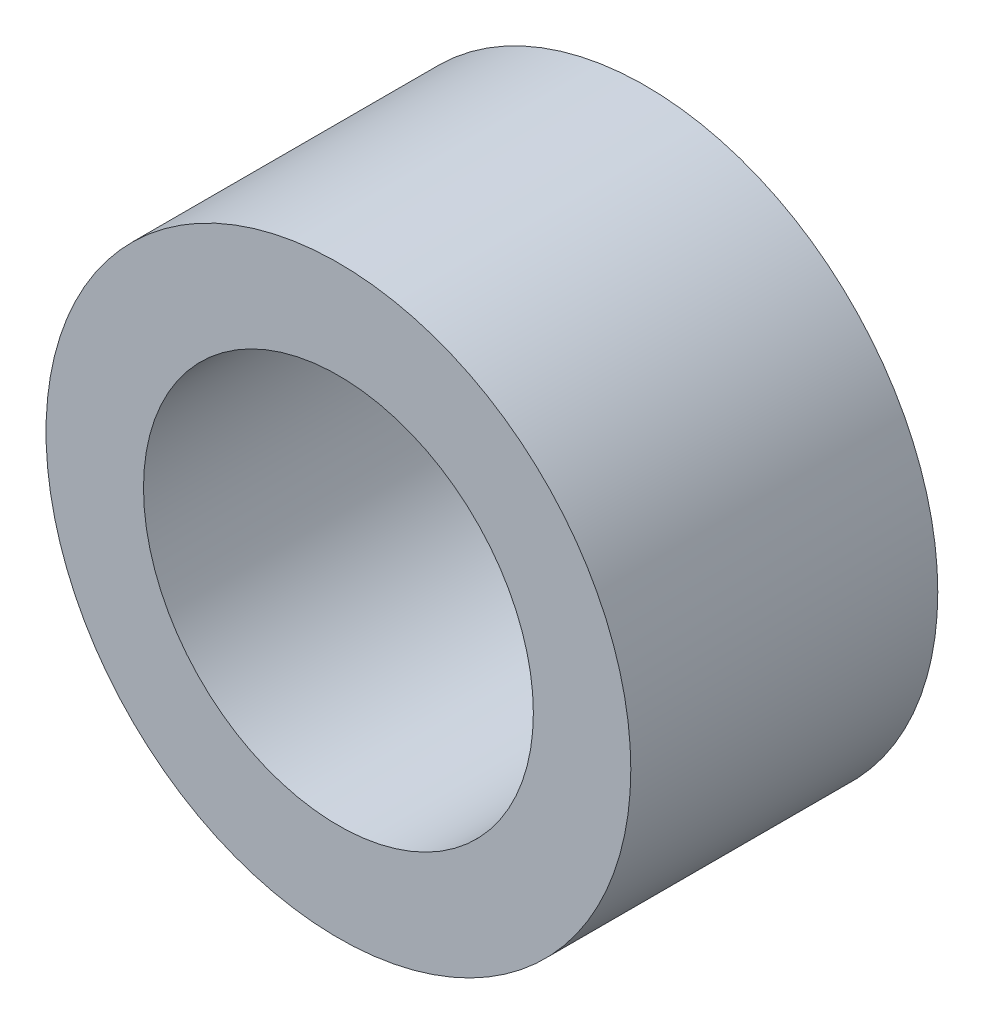
ISO-10303-21;
HEADER;
FILE_DESCRIPTION(('STEP AP214'),'2;1');
FILE_NAME('part.step','',(''),(''),'','','');
FILE_SCHEMA(('AUTOMOTIVE_DESIGN { 1 0 10303 214 1 1 1 1 }'));
ENDSEC;
DATA;
#1=APPLICATION_CONTEXT('core data for automotive mechanical design processes');
#2=APPLICATION_PROTOCOL_DEFINITION('international standard','automotive_design',2000,#1);
#3=PRODUCT_CONTEXT('',#1,'mechanical');
#4=PRODUCT('Part','Part','',(#3));
#5=PRODUCT_RELATED_PRODUCT_CATEGORY('part','',(#4));
#6=PRODUCT_DEFINITION_FORMATION('','',#4);
#7=PRODUCT_DEFINITION_CONTEXT('part definition',#1,'design');
#8=PRODUCT_DEFINITION('design','',#6,#7);
#9=PRODUCT_DEFINITION_SHAPE('','',#8);
#10=(LENGTH_UNIT() NAMED_UNIT(*) SI_UNIT(.MILLI.,.METRE.));
#11=(NAMED_UNIT(*) PLANE_ANGLE_UNIT() SI_UNIT($,.RADIAN.));
#12=(NAMED_UNIT(*) SI_UNIT($,.STERADIAN.) SOLID_ANGLE_UNIT());
#13=UNCERTAINTY_MEASURE_WITH_UNIT(LENGTH_MEASURE(1.E-05),#10,'distance_accuracy_value','');
#14=(GEOMETRIC_REPRESENTATION_CONTEXT(3) GLOBAL_UNCERTAINTY_ASSIGNED_CONTEXT((#13)) GLOBAL_UNIT_ASSIGNED_CONTEXT((#10,
#11,#12)) REPRESENTATION_CONTEXT('',''));
#15=CARTESIAN_POINT('',(0.,0.,0.));
#16=DIRECTION('',(0.,0.,1.));
#17=DIRECTION('',(1.,0.,0.));
#18=AXIS2_PLACEMENT_3D('',#15,#16,#17);
#19=CARTESIAN_POINT('',(0.,0.,10.));
#20=DIRECTION('',(0.,0.,1.));
#21=DIRECTION('',(1.,0.,0.));
#22=AXIS2_PLACEMENT_3D('',#19,#20,#21);
#23=PLANE('',#22);
#24=CARTESIAN_POINT('',(0.,0.,10.));
#25=DIRECTION('',(0.,0.,1.));
#26=DIRECTION('',(1.,0.,0.));
#27=AXIS2_PLACEMENT_3D('',#24,#25,#26);
#28=CIRCLE('',#27,9.525);
#29=CARTESIAN_POINT('',(9.525,0.,10.));
#30=VERTEX_POINT('',#29);
#31=EDGE_CURVE('E10',#30,#30,#28,.T.);
#32=ORIENTED_EDGE('',*,*,#31,.T.);
#33=EDGE_LOOP('',(#32));
#34=FACE_BOUND('',#33,.T.);
#35=CARTESIAN_POINT('',(0.,0.,10.));
#36=DIRECTION('',(0.,0.,1.));
#37=DIRECTION('',(1.,0.,0.));
#38=AXIS2_PLACEMENT_3D('',#35,#36,#37);
#39=CIRCLE('',#38,6.35);
#40=CARTESIAN_POINT('',(6.35,0.,10.));
#41=VERTEX_POINT('',#40);
#42=EDGE_CURVE('E47',#41,#41,#39,.T.);
#43=ORIENTED_EDGE('',*,*,#42,.F.);
#44=EDGE_LOOP('',(#43));
#45=FACE_BOUND('',#44,.T.);
#46=ADVANCED_FACE('F36',(#34,#45),#23,.T.);
#47=CARTESIAN_POINT('',(0.,0.,0.));
#48=DIRECTION('',(0.,0.,1.));
#49=DIRECTION('',(1.,0.,0.));
#50=AXIS2_PLACEMENT_3D('',#47,#48,#49);
#51=PLANE('',#50);
#52=CARTESIAN_POINT('',(0.,0.,0.));
#53=DIRECTION('',(0.,0.,1.));
#54=DIRECTION('',(1.,0.,0.));
#55=AXIS2_PLACEMENT_3D('',#52,#53,#54);
#56=CIRCLE('',#55,9.525);
#57=CARTESIAN_POINT('',(9.525,0.,0.));
#58=VERTEX_POINT('',#57);
#59=EDGE_CURVE('E40',#58,#58,#56,.T.);
#60=ORIENTED_EDGE('',*,*,#59,.F.);
#61=EDGE_LOOP('',(#60));
#62=FACE_BOUND('',#61,.T.);
#63=CARTESIAN_POINT('',(0.,0.,0.));
#64=DIRECTION('',(0.,0.,1.));
#65=DIRECTION('',(1.,0.,0.));
#66=AXIS2_PLACEMENT_3D('',#63,#64,#65);
#67=CIRCLE('',#66,6.35);
#68=CARTESIAN_POINT('',(6.35,0.,0.));
#69=VERTEX_POINT('',#68);
#70=EDGE_CURVE('E49',#69,#69,#67,.T.);
#71=ORIENTED_EDGE('',*,*,#70,.T.);
#72=EDGE_LOOP('',(#71));
#73=FACE_BOUND('',#72,.T.);
#74=ADVANCED_FACE('F59',(#62,#73),#51,.F.);
#75=CARTESIAN_POINT('',(0.,0.,10.));
#76=DIRECTION('',(0.,0.,-1.));
#77=DIRECTION('',(-1.,0.,0.));
#78=AXIS2_PLACEMENT_3D('',#75,#76,#77);
#79=CYLINDRICAL_SURFACE('',#78,9.525);
#80=ORIENTED_EDGE('',*,*,#31,.F.);
#81=EDGE_LOOP('',(#80));
#82=FACE_BOUND('',#81,.T.);
#83=ORIENTED_EDGE('',*,*,#59,.T.);
#84=EDGE_LOOP('',(#83));
#85=FACE_BOUND('',#84,.T.);
#86=ADVANCED_FACE('F38',(#82,#85),#79,.T.);
#87=CARTESIAN_POINT('',(0.,0.,10.));
#88=DIRECTION('',(0.,0.,-1.));
#89=DIRECTION('',(-1.,0.,0.));
#90=AXIS2_PLACEMENT_3D('',#87,#88,#89);
#91=CYLINDRICAL_SURFACE('',#90,6.35);
#92=ORIENTED_EDGE('',*,*,#42,.T.);
#93=EDGE_LOOP('',(#92));
#94=FACE_BOUND('',#93,.T.);
#95=ORIENTED_EDGE('',*,*,#70,.F.);
#96=EDGE_LOOP('',(#95));
#97=FACE_BOUND('',#96,.T.);
#98=ADVANCED_FACE('F55',(#94,#97),#91,.F.);
#99=CLOSED_SHELL('',(#46,#74,#86,#98));
#100=MANIFOLD_SOLID_BREP('B2',#99);
#101=ADVANCED_BREP_SHAPE_REPRESENTATION('',(#18,#100),#14);
#102=SHAPE_DEFINITION_REPRESENTATION(#9,#101);
ENDSEC;
END-ISO-10303-21;
